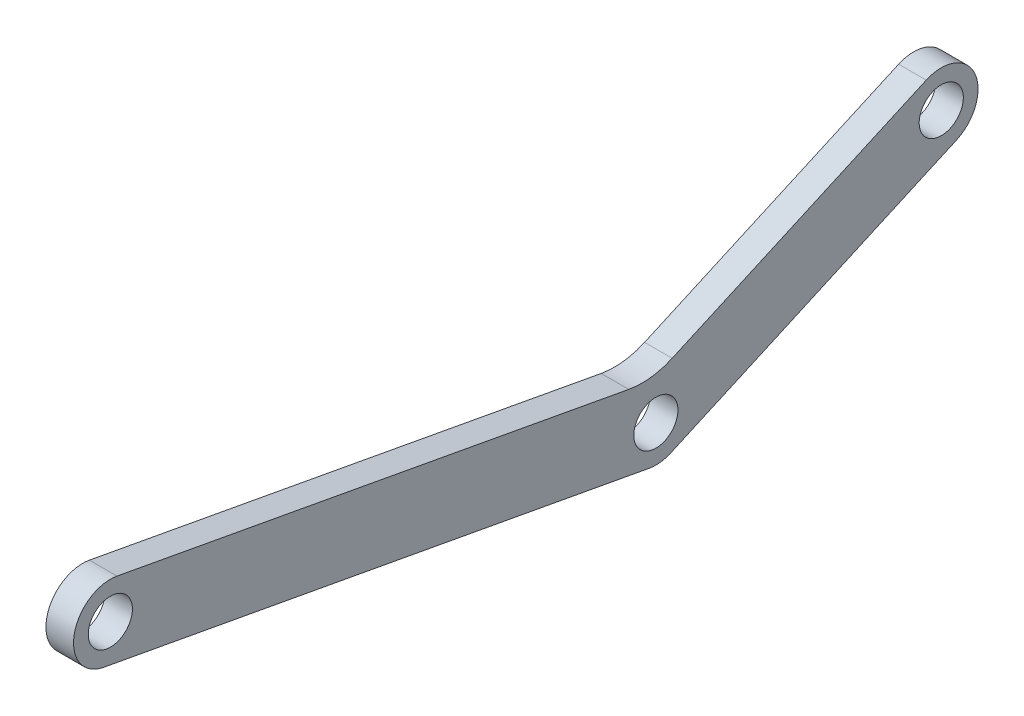
ISO-10303-21;
HEADER;
FILE_DESCRIPTION(('STEP AP214'),'2;1');
FILE_NAME('part.step','',(''),(''),'','','');
FILE_SCHEMA(('AUTOMOTIVE_DESIGN { 1 0 10303 214 1 1 1 1 }'));
ENDSEC;
DATA;
#1=APPLICATION_CONTEXT('core data for automotive mechanical design processes');
#2=APPLICATION_PROTOCOL_DEFINITION('international standard','automotive_design',2000,#1);
#3=PRODUCT_CONTEXT('',#1,'mechanical');
#4=PRODUCT('Part','Part','',(#3));
#5=PRODUCT_RELATED_PRODUCT_CATEGORY('part','',(#4));
#6=PRODUCT_DEFINITION_FORMATION('','',#4);
#7=PRODUCT_DEFINITION_CONTEXT('part definition',#1,'design');
#8=PRODUCT_DEFINITION('design','',#6,#7);
#9=PRODUCT_DEFINITION_SHAPE('','',#8);
#10=(LENGTH_UNIT() NAMED_UNIT(*) SI_UNIT(.MILLI.,.METRE.));
#11=(NAMED_UNIT(*) PLANE_ANGLE_UNIT() SI_UNIT($,.RADIAN.));
#12=(NAMED_UNIT(*) SI_UNIT($,.STERADIAN.) SOLID_ANGLE_UNIT());
#13=UNCERTAINTY_MEASURE_WITH_UNIT(LENGTH_MEASURE(1.E-05),#10,'distance_accuracy_value','');
#14=(GEOMETRIC_REPRESENTATION_CONTEXT(3) GLOBAL_UNCERTAINTY_ASSIGNED_CONTEXT((#13)) GLOBAL_UNIT_ASSIGNED_CONTEXT((#10,
#11,#12)) REPRESENTATION_CONTEXT('',''));
#15=CARTESIAN_POINT('',(0.,0.,0.));
#16=DIRECTION('',(0.,0.,1.));
#17=DIRECTION('',(1.,0.,0.));
#18=AXIS2_PLACEMENT_3D('',#15,#16,#17);
#19=CARTESIAN_POINT('',(-773.875,-73.65,551.64938766));
#20=DIRECTION('',(1.,0.,0.));
#21=DIRECTION('',(0.,0.,-1.));
#22=AXIS2_PLACEMENT_3D('',#19,#20,#21);
#23=PLANE('',#22);
#24=CARTESIAN_POINT('',(-773.875,-128.224072417712,255.133501715319));
#25=DIRECTION('',(1.,0.,0.));
#26=DIRECTION('',(0.,0.,-1.));
#27=AXIS2_PLACEMENT_3D('',#24,#25,#26);
#28=CIRCLE('',#27,12.);
#29=CARTESIAN_POINT('',(-773.875,-128.224072417712,243.133501715318));
#30=VERTEX_POINT('',#29);
#31=EDGE_CURVE('E194',#30,#30,#28,.T.);
#32=ORIENTED_EDGE('',*,*,#31,.F.);
#33=EDGE_LOOP('',(#32));
#34=FACE_BOUND('',#33,.T.);
#35=CARTESIAN_POINT('',(-773.875,-73.65,551.64938766));
#36=DIRECTION('',(1.,0.,0.));
#37=DIRECTION('',(0.,0.,-1.));
#38=AXIS2_PLACEMENT_3D('',#35,#36,#37);
#39=CIRCLE('',#38,20.);
#40=CARTESIAN_POINT('',(-773.875,-53.9803777328953,548.029172214834));
#41=VERTEX_POINT('',#40);
#42=CARTESIAN_POINT('',(-773.875,-93.3196222671047,555.269603105166));
#43=VERTEX_POINT('',#42);
#44=EDGE_CURVE('E157',#41,#43,#39,.T.);
#45=ORIENTED_EDGE('',*,*,#44,.T.);
#46=DIRECTION('',(0.,-0.1810107722583,-0.983481113355236));
#47=VECTOR('',#46,1.);
#48=CARTESIAN_POINT('',(-773.875,-93.3196222671047,555.269603105166));
#49=LINE('',#48,#47);
#50=CARTESIAN_POINT('',(-773.875,-147.893694684817,258.753717160484));
#51=VERTEX_POINT('',#50);
#52=EDGE_CURVE('E105',#43,#51,#49,.T.);
#53=ORIENTED_EDGE('',*,*,#52,.T.);
#54=CARTESIAN_POINT('',(-773.875,-128.224072417712,255.133501715319));
#55=DIRECTION('',(1.,0.,0.));
#56=DIRECTION('',(0.,0.,-1.));
#57=AXIS2_PLACEMENT_3D('',#54,#55,#56);
#58=CIRCLE('',#57,20.);
#59=CARTESIAN_POINT('',(-773.875,-146.475072619514,246.954199077941));
#60=VERTEX_POINT('',#59);
#61=EDGE_CURVE('E172',#51,#60,#58,.T.);
#62=ORIENTED_EDGE('',*,*,#61,.T.);
#63=DIRECTION('',(0.,0.408965131868894,-0.912550010090109));
#64=VECTOR('',#63,1.);
#65=CARTESIAN_POINT('',(-773.875,-76.9510002018022,91.8206973626221));
#66=LINE('',#65,#64);
#67=CARTESIAN_POINT('',(-773.875,-76.9510002018022,91.8206973626221));
#68=VERTEX_POINT('',#67);
#69=EDGE_CURVE('E185',#60,#68,#66,.T.);
#70=ORIENTED_EDGE('',*,*,#69,.T.);
#71=CARTESIAN_POINT('',(-773.875,-58.7,100.));
#72=DIRECTION('',(1.,0.,0.));
#73=DIRECTION('',(0.,0.,-1.));
#74=AXIS2_PLACEMENT_3D('',#71,#72,#73);
#75=CIRCLE('',#74,20.);
#76=CARTESIAN_POINT('',(-773.875,-40.4489997981978,108.179302637378));
#77=VERTEX_POINT('',#76);
#78=EDGE_CURVE('E124',#68,#77,#75,.T.);
#79=ORIENTED_EDGE('',*,*,#78,.T.);
#80=DIRECTION('',(0.,-0.408965131868895,0.912550010090109));
#81=VECTOR('',#80,1.);
#82=CARTESIAN_POINT('',(-773.875,-102.337768012915,246.275662590407));
#83=LINE('',#82,#81);
#84=CARTESIAN_POINT('',(-773.875,-102.337768012915,246.275662590407));
#85=VERTEX_POINT('',#84);
#86=EDGE_CURVE('E118',#77,#85,#83,.T.);
#87=ORIENTED_EDGE('',*,*,#86,.T.);
#88=CARTESIAN_POINT('',(-773.875,-65.8357676093109,262.634267865163));
#89=DIRECTION('',(-1.,0.,0.));
#90=DIRECTION('',(0.,0.,-1.));
#91=AXIS2_PLACEMENT_3D('',#88,#89,#90);
#92=CIRCLE('',#91,40.);
#93=CARTESIAN_POINT('',(-773.875,-105.17501214352,269.874698755495));
#94=VERTEX_POINT('',#93);
#95=EDGE_CURVE('E122',#85,#94,#92,.T.);
#96=ORIENTED_EDGE('',*,*,#95,.T.);
#97=DIRECTION('',(0.,0.1810107722583,0.983481113355236));
#98=VECTOR('',#97,1.);
#99=CARTESIAN_POINT('',(-773.875,-53.9803777328953,548.029172214834));
#100=LINE('',#99,#98);
#101=EDGE_CURVE('E62',#94,#41,#100,.T.);
#102=ORIENTED_EDGE('',*,*,#101,.T.);
#103=EDGE_LOOP('',(#45,#53,#62,#70,#79,#87,#96,#102));
#104=FACE_BOUND('',#103,.T.);
#105=CARTESIAN_POINT('',(-773.875,-58.7,100.));
#106=DIRECTION('',(1.,0.,0.));
#107=DIRECTION('',(0.,0.,-1.));
#108=AXIS2_PLACEMENT_3D('',#105,#106,#107);
#109=CIRCLE('',#108,12.);
#110=CARTESIAN_POINT('',(-773.875,-58.7,88.));
#111=VERTEX_POINT('',#110);
#112=EDGE_CURVE('E146',#111,#111,#109,.T.);
#113=ORIENTED_EDGE('',*,*,#112,.F.);
#114=EDGE_LOOP('',(#113));
#115=FACE_BOUND('',#114,.T.);
#116=CARTESIAN_POINT('',(-773.875,-73.65,551.64938766));
#117=DIRECTION('',(1.,0.,0.));
#118=DIRECTION('',(0.,0.,-1.));
#119=AXIS2_PLACEMENT_3D('',#116,#117,#118);
#120=CIRCLE('',#119,12.0000000000001);
#121=CARTESIAN_POINT('',(-773.875,-73.65,539.64938766));
#122=VERTEX_POINT('',#121);
#123=EDGE_CURVE('E200',#122,#122,#120,.T.);
#124=ORIENTED_EDGE('',*,*,#123,.F.);
#125=EDGE_LOOP('',(#124));
#126=FACE_BOUND('',#125,.T.);
#127=ADVANCED_FACE('F45',(#34,#104,#115,#126),#23,.T.);
#128=CARTESIAN_POINT('',(-788.875,-73.65,551.64938766));
#129=DIRECTION('',(1.,0.,0.));
#130=DIRECTION('',(0.,0.,-1.));
#131=AXIS2_PLACEMENT_3D('',#128,#129,#130);
#132=PLANE('',#131);
#133=CARTESIAN_POINT('',(-788.875,-73.65,551.64938766));
#134=DIRECTION('',(1.,0.,0.));
#135=DIRECTION('',(0.,0.,-1.));
#136=AXIS2_PLACEMENT_3D('',#133,#134,#135);
#137=CIRCLE('',#136,20.);
#138=CARTESIAN_POINT('',(-788.875,-53.9803777328953,548.029172214834));
#139=VERTEX_POINT('',#138);
#140=CARTESIAN_POINT('',(-788.875,-93.3196222671047,555.269603105166));
#141=VERTEX_POINT('',#140);
#142=EDGE_CURVE('E142',#139,#141,#137,.T.);
#143=ORIENTED_EDGE('',*,*,#142,.F.);
#144=DIRECTION('',(0.,0.1810107722583,0.983481113355236));
#145=VECTOR('',#144,1.);
#146=CARTESIAN_POINT('',(-788.875,-53.9803777328953,548.029172214834));
#147=LINE('',#146,#145);
#148=CARTESIAN_POINT('',(-788.875,-105.17501214352,269.874698755495));
#149=VERTEX_POINT('',#148);
#150=EDGE_CURVE('E97',#149,#139,#147,.T.);
#151=ORIENTED_EDGE('',*,*,#150,.F.);
#152=CARTESIAN_POINT('',(-788.875,-65.8357676093109,262.634267865163));
#153=DIRECTION('',(-1.,0.,0.));
#154=DIRECTION('',(0.,0.,-1.));
#155=AXIS2_PLACEMENT_3D('',#152,#153,#154);
#156=CIRCLE('',#155,40.);
#157=CARTESIAN_POINT('',(-788.875,-102.337768012915,246.275662590407));
#158=VERTEX_POINT('',#157);
#159=EDGE_CURVE('E91',#158,#149,#156,.T.);
#160=ORIENTED_EDGE('',*,*,#159,.F.);
#161=DIRECTION('',(0.,-0.408965131868895,0.912550010090109));
#162=VECTOR('',#161,1.);
#163=CARTESIAN_POINT('',(-788.875,-102.337768012915,246.275662590407));
#164=LINE('',#163,#162);
#165=CARTESIAN_POINT('',(-788.875,-40.4489997981978,108.179302637378));
#166=VERTEX_POINT('',#165);
#167=EDGE_CURVE('E132',#166,#158,#164,.T.);
#168=ORIENTED_EDGE('',*,*,#167,.F.);
#169=CARTESIAN_POINT('',(-788.875,-58.7,100.));
#170=DIRECTION('',(1.,0.,0.));
#171=DIRECTION('',(0.,0.,-1.));
#172=AXIS2_PLACEMENT_3D('',#169,#170,#171);
#173=CIRCLE('',#172,20.);
#174=CARTESIAN_POINT('',(-788.875,-76.9510002018022,91.8206973626221));
#175=VERTEX_POINT('',#174);
#176=EDGE_CURVE('E152',#175,#166,#173,.T.);
#177=ORIENTED_EDGE('',*,*,#176,.F.);
#178=DIRECTION('',(0.,0.408965131868894,-0.912550010090109));
#179=VECTOR('',#178,1.);
#180=CARTESIAN_POINT('',(-788.875,-76.9510002018022,91.8206973626221));
#181=LINE('',#180,#179);
#182=CARTESIAN_POINT('',(-788.875,-146.475072619514,246.954199077941));
#183=VERTEX_POINT('',#182);
#184=EDGE_CURVE('E150',#183,#175,#181,.T.);
#185=ORIENTED_EDGE('',*,*,#184,.F.);
#186=CARTESIAN_POINT('',(-788.875,-128.224072417712,255.133501715319));
#187=DIRECTION('',(1.,0.,0.));
#188=DIRECTION('',(0.,0.,-1.));
#189=AXIS2_PLACEMENT_3D('',#186,#187,#188);
#190=CIRCLE('',#189,20.);
#191=CARTESIAN_POINT('',(-788.875,-147.893694684817,258.753717160484));
#192=VERTEX_POINT('',#191);
#193=EDGE_CURVE('E148',#192,#183,#190,.T.);
#194=ORIENTED_EDGE('',*,*,#193,.F.);
#195=DIRECTION('',(0.,-0.1810107722583,-0.983481113355236));
#196=VECTOR('',#195,1.);
#197=CARTESIAN_POINT('',(-788.875,-93.3196222671047,555.269603105166));
#198=LINE('',#197,#196);
#199=EDGE_CURVE('E145',#141,#192,#198,.T.);
#200=ORIENTED_EDGE('',*,*,#199,.F.);
#201=EDGE_LOOP('',(#143,#151,#160,#168,#177,#185,#194,#200));
#202=FACE_BOUND('',#201,.T.);
#203=CARTESIAN_POINT('',(-788.875,-58.7,100.));
#204=DIRECTION('',(1.,0.,0.));
#205=DIRECTION('',(0.,0.,-1.));
#206=AXIS2_PLACEMENT_3D('',#203,#204,#205);
#207=CIRCLE('',#206,12.);
#208=CARTESIAN_POINT('',(-788.875,-58.7,88.));
#209=VERTEX_POINT('',#208);
#210=EDGE_CURVE('E191',#209,#209,#207,.T.);
#211=ORIENTED_EDGE('',*,*,#210,.T.);
#212=EDGE_LOOP('',(#211));
#213=FACE_BOUND('',#212,.T.);
#214=CARTESIAN_POINT('',(-788.875,-128.224072417712,255.133501715319));
#215=DIRECTION('',(1.,0.,0.));
#216=DIRECTION('',(0.,0.,-1.));
#217=AXIS2_PLACEMENT_3D('',#214,#215,#216);
#218=CIRCLE('',#217,12.);
#219=CARTESIAN_POINT('',(-788.875,-128.224072417712,243.133501715318));
#220=VERTEX_POINT('',#219);
#221=EDGE_CURVE('E197',#220,#220,#218,.T.);
#222=ORIENTED_EDGE('',*,*,#221,.T.);
#223=EDGE_LOOP('',(#222));
#224=FACE_BOUND('',#223,.T.);
#225=CARTESIAN_POINT('',(-788.875,-73.65,551.64938766));
#226=DIRECTION('',(1.,0.,0.));
#227=DIRECTION('',(0.,0.,-1.));
#228=AXIS2_PLACEMENT_3D('',#225,#226,#227);
#229=CIRCLE('',#228,12.0000000000001);
#230=CARTESIAN_POINT('',(-788.875,-73.65,539.64938766));
#231=VERTEX_POINT('',#230);
#232=EDGE_CURVE('E203',#231,#231,#229,.T.);
#233=ORIENTED_EDGE('',*,*,#232,.T.);
#234=EDGE_LOOP('',(#233));
#235=FACE_BOUND('',#234,.T.);
#236=ADVANCED_FACE('F176',(#202,#213,#224,#235),#132,.F.);
#237=CARTESIAN_POINT('',(-773.875,-73.65,551.64938766));
#238=DIRECTION('',(-1.,0.,0.));
#239=DIRECTION('',(0.,0.,1.));
#240=AXIS2_PLACEMENT_3D('',#237,#238,#239);
#241=CYLINDRICAL_SURFACE('',#240,20.);
#242=ORIENTED_EDGE('',*,*,#142,.T.);
#243=DIRECTION('',(-1.,0.,0.));
#244=VECTOR('',#243,1.);
#245=CARTESIAN_POINT('',(-773.875,-93.3196222671047,555.269603105166));
#246=LINE('',#245,#244);
#247=EDGE_CURVE('E11',#43,#141,#246,.T.);
#248=ORIENTED_EDGE('',*,*,#247,.F.);
#249=ORIENTED_EDGE('',*,*,#44,.F.);
#250=DIRECTION('',(-1.,0.,0.));
#251=VECTOR('',#250,1.);
#252=CARTESIAN_POINT('',(-773.875,-53.9803777328953,548.029172214834));
#253=LINE('',#252,#251);
#254=EDGE_CURVE('E138',#41,#139,#253,.T.);
#255=ORIENTED_EDGE('',*,*,#254,.T.);
#256=EDGE_LOOP('',(#242,#248,#249,#255));
#257=FACE_BOUND('',#256,.T.);
#258=ADVANCED_FACE('F47',(#257),#241,.T.);
#259=CARTESIAN_POINT('',(-773.875,-93.3196222671047,555.269603105166));
#260=DIRECTION('',(0.,0.983481113355236,-0.1810107722583));
#261=DIRECTION('',(0.,0.1810107722583,0.983481113355236));
#262=AXIS2_PLACEMENT_3D('',#259,#260,#261);
#263=PLANE('',#262);
#264=ORIENTED_EDGE('',*,*,#199,.T.);
#265=DIRECTION('',(-1.,0.,0.));
#266=VECTOR('',#265,1.);
#267=CARTESIAN_POINT('',(-773.875,-147.893694684817,258.753717160484));
#268=LINE('',#267,#266);
#269=EDGE_CURVE('E54',#51,#192,#268,.T.);
#270=ORIENTED_EDGE('',*,*,#269,.F.);
#271=ORIENTED_EDGE('',*,*,#52,.F.);
#272=ORIENTED_EDGE('',*,*,#247,.T.);
#273=EDGE_LOOP('',(#264,#270,#271,#272));
#274=FACE_BOUND('',#273,.T.);
#275=ADVANCED_FACE('F236',(#274),#263,.F.);
#276=CARTESIAN_POINT('',(-773.875,-128.224072417712,255.133501715319));
#277=DIRECTION('',(-1.,0.,0.));
#278=DIRECTION('',(0.,0.,1.));
#279=AXIS2_PLACEMENT_3D('',#276,#277,#278);
#280=CYLINDRICAL_SURFACE('',#279,20.);
#281=ORIENTED_EDGE('',*,*,#193,.T.);
#282=DIRECTION('',(-1.,0.,0.));
#283=VECTOR('',#282,1.);
#284=CARTESIAN_POINT('',(-773.875,-146.475072619514,246.954199077941));
#285=LINE('',#284,#283);
#286=EDGE_CURVE('E164',#60,#183,#285,.T.);
#287=ORIENTED_EDGE('',*,*,#286,.F.);
#288=ORIENTED_EDGE('',*,*,#61,.F.);
#289=ORIENTED_EDGE('',*,*,#269,.T.);
#290=EDGE_LOOP('',(#281,#287,#288,#289));
#291=FACE_BOUND('',#290,.T.);
#292=ADVANCED_FACE('F170',(#291),#280,.T.);
#293=CARTESIAN_POINT('',(-773.875,-76.9510002018022,91.8206973626221));
#294=DIRECTION('',(0.,0.912550010090109,0.408965131868894));
#295=DIRECTION('',(0.,-0.408965131868894,0.912550010090109));
#296=AXIS2_PLACEMENT_3D('',#293,#294,#295);
#297=PLANE('',#296);
#298=ORIENTED_EDGE('',*,*,#184,.T.);
#299=DIRECTION('',(-1.,0.,0.));
#300=VECTOR('',#299,1.);
#301=CARTESIAN_POINT('',(-773.875,-76.9510002018022,91.8206973626221));
#302=LINE('',#301,#300);
#303=EDGE_CURVE('E161',#68,#175,#302,.T.);
#304=ORIENTED_EDGE('',*,*,#303,.F.);
#305=ORIENTED_EDGE('',*,*,#69,.F.);
#306=ORIENTED_EDGE('',*,*,#286,.T.);
#307=EDGE_LOOP('',(#298,#304,#305,#306));
#308=FACE_BOUND('',#307,.T.);
#309=ADVANCED_FACE('F181',(#308),#297,.F.);
#310=CARTESIAN_POINT('',(-773.875,-58.7,100.));
#311=DIRECTION('',(-1.,0.,0.));
#312=DIRECTION('',(0.,0.,1.));
#313=AXIS2_PLACEMENT_3D('',#310,#311,#312);
#314=CYLINDRICAL_SURFACE('',#313,20.);
#315=ORIENTED_EDGE('',*,*,#176,.T.);
#316=DIRECTION('',(-1.,0.,0.));
#317=VECTOR('',#316,1.);
#318=CARTESIAN_POINT('',(-773.875,-40.4489997981978,108.179302637378));
#319=LINE('',#318,#317);
#320=EDGE_CURVE('E133',#77,#166,#319,.T.);
#321=ORIENTED_EDGE('',*,*,#320,.F.);
#322=ORIENTED_EDGE('',*,*,#78,.F.);
#323=ORIENTED_EDGE('',*,*,#303,.T.);
#324=EDGE_LOOP('',(#315,#321,#322,#323));
#325=FACE_BOUND('',#324,.T.);
#326=ADVANCED_FACE('F184',(#325),#314,.T.);
#327=CARTESIAN_POINT('',(-773.875,-102.337768012915,246.275662590407));
#328=DIRECTION('',(0.,-0.912550010090109,-0.408965131868895));
#329=DIRECTION('',(0.,0.408965131868895,-0.912550010090109));
#330=AXIS2_PLACEMENT_3D('',#327,#328,#329);
#331=PLANE('',#330);
#332=ORIENTED_EDGE('',*,*,#167,.T.);
#333=DIRECTION('',(-1.,0.,0.));
#334=VECTOR('',#333,1.);
#335=CARTESIAN_POINT('',(-773.875,-102.337768012915,246.275662590407));
#336=LINE('',#335,#334);
#337=EDGE_CURVE('E129',#85,#158,#336,.T.);
#338=ORIENTED_EDGE('',*,*,#337,.F.);
#339=ORIENTED_EDGE('',*,*,#86,.F.);
#340=ORIENTED_EDGE('',*,*,#320,.T.);
#341=EDGE_LOOP('',(#332,#338,#339,#340));
#342=FACE_BOUND('',#341,.T.);
#343=ADVANCED_FACE('F130',(#342),#331,.F.);
#344=CARTESIAN_POINT('',(-773.875,-65.8357676093109,262.634267865163));
#345=DIRECTION('',(-1.,0.,0.));
#346=DIRECTION('',(0.,0.,1.));
#347=AXIS2_PLACEMENT_3D('',#344,#345,#346);
#348=CYLINDRICAL_SURFACE('',#347,40.);
#349=ORIENTED_EDGE('',*,*,#159,.T.);
#350=DIRECTION('',(-1.,0.,0.));
#351=VECTOR('',#350,1.);
#352=CARTESIAN_POINT('',(-773.875,-105.17501214352,269.874698755495));
#353=LINE('',#352,#351);
#354=EDGE_CURVE('E134',#94,#149,#353,.T.);
#355=ORIENTED_EDGE('',*,*,#354,.F.);
#356=ORIENTED_EDGE('',*,*,#95,.F.);
#357=ORIENTED_EDGE('',*,*,#337,.T.);
#358=EDGE_LOOP('',(#349,#355,#356,#357));
#359=FACE_BOUND('',#358,.T.);
#360=ADVANCED_FACE('F136',(#359),#348,.F.);
#361=CARTESIAN_POINT('',(-773.875,-53.9803777328953,548.029172214834));
#362=DIRECTION('',(0.,-0.983481113355236,0.1810107722583));
#363=DIRECTION('',(0.,-0.1810107722583,-0.983481113355236));
#364=AXIS2_PLACEMENT_3D('',#361,#362,#363);
#365=PLANE('',#364);
#366=ORIENTED_EDGE('',*,*,#150,.T.);
#367=ORIENTED_EDGE('',*,*,#254,.F.);
#368=ORIENTED_EDGE('',*,*,#101,.F.);
#369=ORIENTED_EDGE('',*,*,#354,.T.);
#370=EDGE_LOOP('',(#366,#367,#368,#369));
#371=FACE_BOUND('',#370,.T.);
#372=ADVANCED_FACE('F224',(#371),#365,.F.);
#373=CARTESIAN_POINT('',(-773.875,-58.7,100.));
#374=DIRECTION('',(-1.,0.,0.));
#375=DIRECTION('',(0.,0.,1.));
#376=AXIS2_PLACEMENT_3D('',#373,#374,#375);
#377=CYLINDRICAL_SURFACE('',#376,12.);
#378=ORIENTED_EDGE('',*,*,#112,.T.);
#379=EDGE_LOOP('',(#378));
#380=FACE_BOUND('',#379,.T.);
#381=ORIENTED_EDGE('',*,*,#210,.F.);
#382=EDGE_LOOP('',(#381));
#383=FACE_BOUND('',#382,.T.);
#384=ADVANCED_FACE('F221',(#380,#383),#377,.F.);
#385=CARTESIAN_POINT('',(-773.875,-128.224072417712,255.133501715319));
#386=DIRECTION('',(-1.,0.,0.));
#387=DIRECTION('',(0.,0.,1.));
#388=AXIS2_PLACEMENT_3D('',#385,#386,#387);
#389=CYLINDRICAL_SURFACE('',#388,12.);
#390=ORIENTED_EDGE('',*,*,#31,.T.);
#391=EDGE_LOOP('',(#390));
#392=FACE_BOUND('',#391,.T.);
#393=ORIENTED_EDGE('',*,*,#221,.F.);
#394=EDGE_LOOP('',(#393));
#395=FACE_BOUND('',#394,.T.);
#396=ADVANCED_FACE('F302',(#392,#395),#389,.F.);
#397=CARTESIAN_POINT('',(-773.875,-73.65,551.64938766));
#398=DIRECTION('',(-1.,0.,0.));
#399=DIRECTION('',(0.,0.,1.));
#400=AXIS2_PLACEMENT_3D('',#397,#398,#399);
#401=CYLINDRICAL_SURFACE('',#400,12.0000000000001);
#402=ORIENTED_EDGE('',*,*,#123,.T.);
#403=EDGE_LOOP('',(#402));
#404=FACE_BOUND('',#403,.T.);
#405=ORIENTED_EDGE('',*,*,#232,.F.);
#406=EDGE_LOOP('',(#405));
#407=FACE_BOUND('',#406,.T.);
#408=ADVANCED_FACE('F209',(#404,#407),#401,.F.);
#409=CLOSED_SHELL('',(#127,#236,#258,#275,#292,#309,#326,#343,#360,#372,#384,#396,#408));
#410=MANIFOLD_SOLID_BREP('B2',#409);
#411=ADVANCED_BREP_SHAPE_REPRESENTATION('',(#18,#410),#14);
#412=SHAPE_DEFINITION_REPRESENTATION(#9,#411);
ENDSEC;
END-ISO-10303-21;
